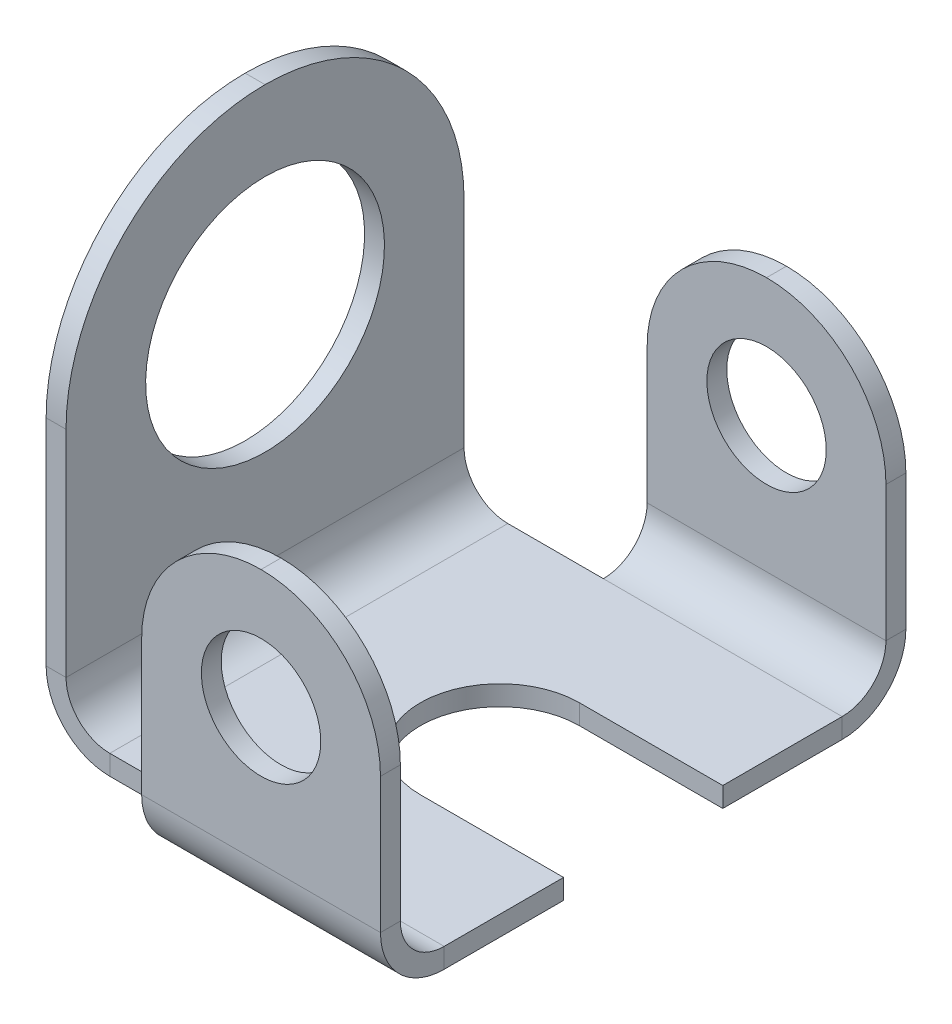
ISO-10303-21;
HEADER;
FILE_DESCRIPTION(('STEP AP214'),'2;1');
FILE_NAME('part.step','',(''),(''),'','','');
FILE_SCHEMA(('AUTOMOTIVE_DESIGN { 1 0 10303 214 1 1 1 1 }'));
ENDSEC;
DATA;
#1=APPLICATION_CONTEXT('core data for automotive mechanical design processes');
#2=APPLICATION_PROTOCOL_DEFINITION('international standard','automotive_design',2000,#1);
#3=PRODUCT_CONTEXT('',#1,'mechanical');
#4=PRODUCT('Part','Part','',(#3));
#5=PRODUCT_RELATED_PRODUCT_CATEGORY('part','',(#4));
#6=PRODUCT_DEFINITION_FORMATION('','',#4);
#7=PRODUCT_DEFINITION_CONTEXT('part definition',#1,'design');
#8=PRODUCT_DEFINITION('design','',#6,#7);
#9=PRODUCT_DEFINITION_SHAPE('','',#8);
#10=(LENGTH_UNIT() NAMED_UNIT(*) SI_UNIT(.MILLI.,.METRE.));
#11=(NAMED_UNIT(*) PLANE_ANGLE_UNIT() SI_UNIT($,.RADIAN.));
#12=(NAMED_UNIT(*) SI_UNIT($,.STERADIAN.) SOLID_ANGLE_UNIT());
#13=UNCERTAINTY_MEASURE_WITH_UNIT(LENGTH_MEASURE(1.E-05),#10,'distance_accuracy_value','');
#14=(GEOMETRIC_REPRESENTATION_CONTEXT(3) GLOBAL_UNCERTAINTY_ASSIGNED_CONTEXT((#13)) GLOBAL_UNIT_ASSIGNED_CONTEXT((#10,
#11,#12)) REPRESENTATION_CONTEXT('',''));
#15=CARTESIAN_POINT('',(0.,0.,0.));
#16=DIRECTION('',(0.,0.,1.));
#17=DIRECTION('',(1.,0.,0.));
#18=AXIS2_PLACEMENT_3D('',#15,#16,#17);
#19=CARTESIAN_POINT('',(25.,2.5,25.));
#20=DIRECTION('',(-1.,0.,0.));
#21=DIRECTION('',(0.,0.,1.));
#22=AXIS2_PLACEMENT_3D('',#19,#20,#21);
#23=PLANE('',#22);
#24=DIRECTION('',(0.,0.,-1.));
#25=VECTOR('',#24,1.);
#26=CARTESIAN_POINT('',(25.,2.5,25.));
#27=LINE('',#26,#25);
#28=CARTESIAN_POINT('',(25.,2.5,-10.));
#29=VERTEX_POINT('',#28);
#30=CARTESIAN_POINT('',(25.,2.49999999999994,-25.));
#31=VERTEX_POINT('',#30);
#32=EDGE_CURVE('E512',#29,#31,#27,.T.);
#33=ORIENTED_EDGE('',*,*,#32,.F.);
#34=DIRECTION('',(0.,-1.,0.));
#35=VECTOR('',#34,1.);
#36=CARTESIAN_POINT('',(25.,2.5,-10.));
#37=LINE('',#36,#35);
#38=CARTESIAN_POINT('',(25.,0.,-10.));
#39=VERTEX_POINT('',#38);
#40=EDGE_CURVE('E13',#29,#39,#37,.T.);
#41=ORIENTED_EDGE('',*,*,#40,.T.);
#42=DIRECTION('',(0.,0.,-1.));
#43=VECTOR('',#42,1.);
#44=CARTESIAN_POINT('',(25.,0.,25.));
#45=LINE('',#44,#43);
#46=CARTESIAN_POINT('',(25.,0.,-25.));
#47=VERTEX_POINT('',#46);
#48=EDGE_CURVE('E505',#39,#47,#45,.T.);
#49=ORIENTED_EDGE('',*,*,#48,.T.);
#50=DIRECTION('',(0.,-1.,0.));
#51=VECTOR('',#50,1.);
#52=CARTESIAN_POINT('',(25.,2.5,-25.));
#53=LINE('',#52,#51);
#54=EDGE_CURVE('E534',#31,#47,#53,.T.);
#55=ORIENTED_EDGE('',*,*,#54,.F.);
#56=EDGE_LOOP('',(#33,#41,#49,#55));
#57=FACE_BOUND('',#56,.T.);
#58=ADVANCED_FACE('F102',(#57),#23,.F.);
#59=CARTESIAN_POINT('',(-25.,2.5,25.));
#60=DIRECTION('',(0.,0.,-1.));
#61=DIRECTION('',(-1.,0.,0.));
#62=AXIS2_PLACEMENT_3D('',#59,#60,#61);
#63=PLANE('',#62);
#64=DIRECTION('',(0.,-1.,0.));
#65=VECTOR('',#64,1.);
#66=CARTESIAN_POINT('',(-5.,2.49999999999998,25.));
#67=LINE('',#66,#65);
#68=CARTESIAN_POINT('',(-5.,2.5,25.));
#69=VERTEX_POINT('',#68);
#70=CARTESIAN_POINT('',(-5.,0.,25.));
#71=VERTEX_POINT('',#70);
#72=EDGE_CURVE('E416',#69,#71,#67,.T.);
#73=ORIENTED_EDGE('',*,*,#72,.F.);
#74=DIRECTION('',(1.,0.,0.));
#75=VECTOR('',#74,1.);
#76=CARTESIAN_POINT('',(-25.,2.5,25.));
#77=LINE('',#76,#75);
#78=CARTESIAN_POINT('',(-17.,2.5,25.));
#79=VERTEX_POINT('',#78);
#80=EDGE_CURVE('E519',#79,#69,#77,.T.);
#81=ORIENTED_EDGE('',*,*,#80,.F.);
#82=DIRECTION('',(0.,-1.,0.));
#83=VECTOR('',#82,1.);
#84=CARTESIAN_POINT('',(-17.,2.5,25.));
#85=LINE('',#84,#83);
#86=CARTESIAN_POINT('',(-17.,0.,25.));
#87=VERTEX_POINT('',#86);
#88=EDGE_CURVE('E482',#79,#87,#85,.T.);
#89=ORIENTED_EDGE('',*,*,#88,.T.);
#90=DIRECTION('',(1.,0.,0.));
#91=VECTOR('',#90,1.);
#92=CARTESIAN_POINT('',(-25.,0.,25.));
#93=LINE('',#92,#91);
#94=EDGE_CURVE('E529',#87,#71,#93,.T.);
#95=ORIENTED_EDGE('',*,*,#94,.T.);
#96=EDGE_LOOP('',(#73,#81,#89,#95));
#97=FACE_BOUND('',#96,.T.);
#98=ADVANCED_FACE('F648',(#97),#63,.F.);
#99=CARTESIAN_POINT('',(-25.,2.5,-25.));
#100=DIRECTION('',(0.,0.,1.));
#101=DIRECTION('',(1.,0.,0.));
#102=AXIS2_PLACEMENT_3D('',#99,#100,#101);
#103=PLANE('',#102);
#104=DIRECTION('',(-1.,0.,0.));
#105=VECTOR('',#104,1.);
#106=CARTESIAN_POINT('',(-25.,2.5,-25.));
#107=LINE('',#106,#105);
#108=CARTESIAN_POINT('',(-5.,2.49999999999994,-25.));
#109=VERTEX_POINT('',#108);
#110=CARTESIAN_POINT('',(-17.,2.5,-25.));
#111=VERTEX_POINT('',#110);
#112=EDGE_CURVE('E509',#109,#111,#107,.T.);
#113=ORIENTED_EDGE('',*,*,#112,.F.);
#114=DIRECTION('',(0.,-1.,0.));
#115=VECTOR('',#114,1.);
#116=CARTESIAN_POINT('',(-5.,2.49999999999994,-25.));
#117=LINE('',#116,#115);
#118=CARTESIAN_POINT('',(-5.,0.,-25.));
#119=VERTEX_POINT('',#118);
#120=EDGE_CURVE('E365',#109,#119,#117,.T.);
#121=ORIENTED_EDGE('',*,*,#120,.T.);
#122=DIRECTION('',(-1.,0.,0.));
#123=VECTOR('',#122,1.);
#124=CARTESIAN_POINT('',(-25.,0.,-25.));
#125=LINE('',#124,#123);
#126=CARTESIAN_POINT('',(-17.,0.,-25.));
#127=VERTEX_POINT('',#126);
#128=EDGE_CURVE('E522',#119,#127,#125,.T.);
#129=ORIENTED_EDGE('',*,*,#128,.T.);
#130=DIRECTION('',(0.,-1.,0.));
#131=VECTOR('',#130,1.);
#132=CARTESIAN_POINT('',(-17.,2.5,-25.));
#133=LINE('',#132,#131);
#134=EDGE_CURVE('E498',#111,#127,#133,.T.);
#135=ORIENTED_EDGE('',*,*,#134,.F.);
#136=EDGE_LOOP('',(#113,#121,#129,#135));
#137=FACE_BOUND('',#136,.T.);
#138=ADVANCED_FACE('F750',(#137),#103,.F.);
#139=CARTESIAN_POINT('',(0.,2.5,0.));
#140=DIRECTION('',(0.,-1.,0.));
#141=DIRECTION('',(0.,0.,-1.));
#142=AXIS2_PLACEMENT_3D('',#139,#140,#141);
#143=PLANE('',#142);
#144=CARTESIAN_POINT('',(7.,2.5,0.));
#145=DIRECTION('',(0.,-1.,0.));
#146=DIRECTION('',(0.,0.,-1.));
#147=AXIS2_PLACEMENT_3D('',#144,#145,#146);
#148=CIRCLE('',#147,10.);
#149=CARTESIAN_POINT('',(7.,2.5,10.));
#150=VERTEX_POINT('',#149);
#151=CARTESIAN_POINT('',(7.,2.5,-10.));
#152=VERTEX_POINT('',#151);
#153=EDGE_CURVE('E285',#150,#152,#148,.T.);
#154=ORIENTED_EDGE('',*,*,#153,.T.);
#155=DIRECTION('',(1.,0.,0.));
#156=VECTOR('',#155,1.);
#157=CARTESIAN_POINT('',(0.,2.5,-10.));
#158=LINE('',#157,#156);
#159=EDGE_CURVE('E310',#152,#29,#158,.T.);
#160=ORIENTED_EDGE('',*,*,#159,.T.);
#161=ORIENTED_EDGE('',*,*,#32,.T.);
#162=EDGE_CURVE('E515',#31,#109,#107,.T.);
#163=ORIENTED_EDGE('',*,*,#162,.T.);
#164=ORIENTED_EDGE('',*,*,#112,.T.);
#165=DIRECTION('',(0.,0.,1.));
#166=VECTOR('',#165,1.);
#167=CARTESIAN_POINT('',(-17.,2.5,25.));
#168=LINE('',#167,#166);
#169=EDGE_CURVE('E493',#79,#111,#168,.F.);
#170=ORIENTED_EDGE('',*,*,#169,.F.);
#171=ORIENTED_EDGE('',*,*,#80,.T.);
#172=DIRECTION('',(1.,0.,0.));
#173=VECTOR('',#172,1.);
#174=CARTESIAN_POINT('',(25.,2.49999999999998,25.));
#175=LINE('',#174,#173);
#176=CARTESIAN_POINT('',(25.,2.5,25.));
#177=VERTEX_POINT('',#176);
#178=EDGE_CURVE('E425',#177,#69,#175,.F.);
#179=ORIENTED_EDGE('',*,*,#178,.F.);
#180=CARTESIAN_POINT('',(25.,2.5,10.));
#181=VERTEX_POINT('',#180);
#182=EDGE_CURVE('E506',#177,#181,#27,.T.);
#183=ORIENTED_EDGE('',*,*,#182,.T.);
#184=DIRECTION('',(-1.,0.,0.));
#185=VECTOR('',#184,1.);
#186=CARTESIAN_POINT('',(0.,2.5,10.));
#187=LINE('',#186,#185);
#188=EDGE_CURVE('E122',#181,#150,#187,.T.);
#189=ORIENTED_EDGE('',*,*,#188,.T.);
#190=EDGE_LOOP('',(#154,#160,#161,#163,#164,#170,#171,#179,#183,#189));
#191=FACE_BOUND('',#190,.T.);
#192=ADVANCED_FACE('F615',(#191),#143,.F.);
#193=CARTESIAN_POINT('',(0.,0.,0.));
#194=DIRECTION('',(0.,-1.,0.));
#195=DIRECTION('',(0.,0.,-1.));
#196=AXIS2_PLACEMENT_3D('',#193,#194,#195);
#197=PLANE('',#196);
#198=DIRECTION('',(-1.,0.,0.));
#199=VECTOR('',#198,1.);
#200=CARTESIAN_POINT('',(7.,0.,-10.));
#201=LINE('',#200,#199);
#202=CARTESIAN_POINT('',(7.,0.,-10.));
#203=VERTEX_POINT('',#202);
#204=EDGE_CURVE('E284',#39,#203,#201,.T.);
#205=ORIENTED_EDGE('',*,*,#204,.T.);
#206=CARTESIAN_POINT('',(7.,0.,0.));
#207=DIRECTION('',(0.,1.,0.));
#208=DIRECTION('',(0.,0.,1.));
#209=AXIS2_PLACEMENT_3D('',#206,#207,#208);
#210=CIRCLE('',#209,10.);
#211=CARTESIAN_POINT('',(7.,0.,10.));
#212=VERTEX_POINT('',#211);
#213=EDGE_CURVE('E276',#203,#212,#210,.T.);
#214=ORIENTED_EDGE('',*,*,#213,.T.);
#215=DIRECTION('',(1.,0.,0.));
#216=VECTOR('',#215,1.);
#217=CARTESIAN_POINT('',(7.,0.,10.));
#218=LINE('',#217,#216);
#219=CARTESIAN_POINT('',(25.,0.,10.));
#220=VERTEX_POINT('',#219);
#221=EDGE_CURVE('E287',#212,#220,#218,.T.);
#222=ORIENTED_EDGE('',*,*,#221,.T.);
#223=CARTESIAN_POINT('',(25.,0.,25.));
#224=VERTEX_POINT('',#223);
#225=EDGE_CURVE('E521',#224,#220,#45,.T.);
#226=ORIENTED_EDGE('',*,*,#225,.F.);
#227=DIRECTION('',(1.,0.,0.));
#228=VECTOR('',#227,1.);
#229=CARTESIAN_POINT('',(25.,0.,25.));
#230=LINE('',#229,#228);
#231=EDGE_CURVE('E410',#224,#71,#230,.F.);
#232=ORIENTED_EDGE('',*,*,#231,.T.);
#233=ORIENTED_EDGE('',*,*,#94,.F.);
#234=DIRECTION('',(0.,0.,1.));
#235=VECTOR('',#234,1.);
#236=CARTESIAN_POINT('',(-17.,0.,25.));
#237=LINE('',#236,#235);
#238=EDGE_CURVE('E471',#87,#127,#237,.F.);
#239=ORIENTED_EDGE('',*,*,#238,.T.);
#240=ORIENTED_EDGE('',*,*,#128,.F.);
#241=EDGE_CURVE('E524',#47,#119,#125,.T.);
#242=ORIENTED_EDGE('',*,*,#241,.F.);
#243=ORIENTED_EDGE('',*,*,#48,.F.);
#244=EDGE_LOOP('',(#205,#214,#222,#226,#232,#233,#239,#240,#242,#243));
#245=FACE_BOUND('',#244,.T.);
#246=ADVANCED_FACE('F294',(#245),#197,.T.);
#247=ORIENTED_EDGE('',*,*,#225,.T.);
#248=DIRECTION('',(0.,1.,0.));
#249=VECTOR('',#248,1.);
#250=CARTESIAN_POINT('',(25.,2.5,10.));
#251=LINE('',#250,#249);
#252=EDGE_CURVE('E112',#220,#181,#251,.T.);
#253=ORIENTED_EDGE('',*,*,#252,.T.);
#254=ORIENTED_EDGE('',*,*,#182,.F.);
#255=DIRECTION('',(0.,-1.,0.));
#256=VECTOR('',#255,1.);
#257=CARTESIAN_POINT('',(25.,2.5,25.));
#258=LINE('',#257,#256);
#259=EDGE_CURVE('E517',#177,#224,#258,.T.);
#260=ORIENTED_EDGE('',*,*,#259,.T.);
#261=EDGE_LOOP('',(#247,#253,#254,#260));
#262=FACE_BOUND('',#261,.T.);
#263=ADVANCED_FACE('F607',(#262),#23,.F.);
#264=CARTESIAN_POINT('',(-17.,8.,-25.));
#265=DIRECTION('',(0.,0.,-1.));
#266=DIRECTION('',(-1.,0.,0.));
#267=AXIS2_PLACEMENT_3D('',#264,#265,#266);
#268=PLANE('',#267);
#269=DIRECTION('',(-1.,0.,0.));
#270=VECTOR('',#269,1.);
#271=CARTESIAN_POINT('',(-25.,7.99999999999997,-25.));
#272=LINE('',#271,#270);
#273=CARTESIAN_POINT('',(-22.5,7.99999999999998,-25.));
#274=VERTEX_POINT('',#273);
#275=CARTESIAN_POINT('',(-25.,7.99999999999997,-25.));
#276=VERTEX_POINT('',#275);
#277=EDGE_CURVE('E468',#274,#276,#272,.T.);
#278=ORIENTED_EDGE('',*,*,#277,.F.);
#279=CARTESIAN_POINT('',(-17.,8.,-25.));
#280=DIRECTION('',(0.,0.,1.));
#281=DIRECTION('',(1.,0.,0.));
#282=AXIS2_PLACEMENT_3D('',#279,#280,#281);
#283=CIRCLE('',#282,5.5);
#284=EDGE_CURVE('E487',#111,#274,#283,.F.);
#285=ORIENTED_EDGE('',*,*,#284,.F.);
#286=ORIENTED_EDGE('',*,*,#134,.T.);
#287=CARTESIAN_POINT('',(-17.,8.,-25.));
#288=DIRECTION('',(0.,0.,1.));
#289=DIRECTION('',(1.,0.,0.));
#290=AXIS2_PLACEMENT_3D('',#287,#288,#289);
#291=CIRCLE('',#290,8.);
#292=EDGE_CURVE('E476',#127,#276,#291,.F.);
#293=ORIENTED_EDGE('',*,*,#292,.T.);
#294=EDGE_LOOP('',(#278,#285,#286,#293));
#295=FACE_BOUND('',#294,.T.);
#296=ADVANCED_FACE('F751',(#295),#268,.T.);
#297=CARTESIAN_POINT('',(-17.,8.,25.));
#298=DIRECTION('',(0.,0.,-1.));
#299=DIRECTION('',(-1.,0.,0.));
#300=AXIS2_PLACEMENT_3D('',#297,#298,#299);
#301=PLANE('',#300);
#302=CARTESIAN_POINT('',(-17.,8.,25.));
#303=DIRECTION('',(0.,0.,1.));
#304=DIRECTION('',(1.,0.,0.));
#305=AXIS2_PLACEMENT_3D('',#302,#303,#304);
#306=CIRCLE('',#305,5.5);
#307=CARTESIAN_POINT('',(-22.5,7.99999999999998,25.));
#308=VERTEX_POINT('',#307);
#309=EDGE_CURVE('E447',#308,#79,#306,.T.);
#310=ORIENTED_EDGE('',*,*,#309,.F.);
#311=DIRECTION('',(-1.,0.,0.));
#312=VECTOR('',#311,1.);
#313=CARTESIAN_POINT('',(-22.5,7.99999999999998,25.));
#314=LINE('',#313,#312);
#315=CARTESIAN_POINT('',(-25.,7.99999999999997,25.));
#316=VERTEX_POINT('',#315);
#317=EDGE_CURVE('E465',#308,#316,#314,.T.);
#318=ORIENTED_EDGE('',*,*,#317,.T.);
#319=CARTESIAN_POINT('',(-17.,8.,25.));
#320=DIRECTION('',(0.,0.,1.));
#321=DIRECTION('',(1.,0.,0.));
#322=AXIS2_PLACEMENT_3D('',#319,#320,#321);
#323=CIRCLE('',#322,8.);
#324=EDGE_CURVE('E477',#316,#87,#323,.T.);
#325=ORIENTED_EDGE('',*,*,#324,.T.);
#326=ORIENTED_EDGE('',*,*,#88,.F.);
#327=EDGE_LOOP('',(#310,#318,#325,#326));
#328=FACE_BOUND('',#327,.T.);
#329=ADVANCED_FACE('F655',(#328),#301,.F.);
#330=CARTESIAN_POINT('',(-17.,8.,25.));
#331=DIRECTION('',(0.,0.,1.));
#332=DIRECTION('',(-1.,0.,0.));
#333=AXIS2_PLACEMENT_3D('',#330,#331,#332);
#334=CYLINDRICAL_SURFACE('',#333,8.);
#335=ORIENTED_EDGE('',*,*,#238,.F.);
#336=ORIENTED_EDGE('',*,*,#324,.F.);
#337=DIRECTION('',(0.,0.,1.));
#338=VECTOR('',#337,1.);
#339=CARTESIAN_POINT('',(-25.,7.99999999999997,0.));
#340=LINE('',#339,#338);
#341=EDGE_CURVE('E458',#276,#316,#340,.T.);
#342=ORIENTED_EDGE('',*,*,#341,.F.);
#343=ORIENTED_EDGE('',*,*,#292,.F.);
#344=EDGE_LOOP('',(#335,#336,#342,#343));
#345=FACE_BOUND('',#344,.T.);
#346=ADVANCED_FACE('F753',(#345),#334,.T.);
#347=CARTESIAN_POINT('',(-17.,8.,25.));
#348=DIRECTION('',(0.,0.,1.));
#349=DIRECTION('',(-1.,0.,0.));
#350=AXIS2_PLACEMENT_3D('',#347,#348,#349);
#351=CYLINDRICAL_SURFACE('',#350,5.5);
#352=ORIENTED_EDGE('',*,*,#169,.T.);
#353=ORIENTED_EDGE('',*,*,#284,.T.);
#354=DIRECTION('',(0.,0.,-1.));
#355=VECTOR('',#354,1.);
#356=CARTESIAN_POINT('',(-22.5,7.99999999999998,-25.));
#357=LINE('',#356,#355);
#358=EDGE_CURVE('E467',#274,#308,#357,.F.);
#359=ORIENTED_EDGE('',*,*,#358,.T.);
#360=ORIENTED_EDGE('',*,*,#309,.T.);
#361=EDGE_LOOP('',(#352,#353,#359,#360));
#362=FACE_BOUND('',#361,.T.);
#363=ADVANCED_FACE('F658',(#362),#351,.F.);
#364=CARTESIAN_POINT('',(-25.,2.49999999999999,25.));
#365=DIRECTION('',(0.,0.,1.));
#366=DIRECTION('',(1.,0.,0.));
#367=AXIS2_PLACEMENT_3D('',#364,#365,#366);
#368=PLANE('',#367);
#369=DIRECTION('',(0.,1.,0.));
#370=VECTOR('',#369,1.);
#371=CARTESIAN_POINT('',(-22.5,0.,25.));
#372=LINE('',#371,#370);
#373=CARTESIAN_POINT('',(-22.5000000000001,35.,25.));
#374=VERTEX_POINT('',#373);
#375=EDGE_CURVE('E454',#374,#308,#372,.F.);
#376=ORIENTED_EDGE('',*,*,#375,.F.);
#377=DIRECTION('',(1.,0.,0.));
#378=VECTOR('',#377,1.);
#379=CARTESIAN_POINT('',(-25.0000000000001,35.,25.));
#380=LINE('',#379,#378);
#381=CARTESIAN_POINT('',(-25.0000000000001,35.,25.));
#382=VERTEX_POINT('',#381);
#383=EDGE_CURVE('E555',#374,#382,#380,.F.);
#384=ORIENTED_EDGE('',*,*,#383,.T.);
#385=DIRECTION('',(0.,-1.,0.));
#386=VECTOR('',#385,1.);
#387=CARTESIAN_POINT('',(-25.,2.49999999999999,25.));
#388=LINE('',#387,#386);
#389=EDGE_CURVE('E442',#382,#316,#388,.T.);
#390=ORIENTED_EDGE('',*,*,#389,.T.);
#391=ORIENTED_EDGE('',*,*,#317,.F.);
#392=EDGE_LOOP('',(#376,#384,#390,#391));
#393=FACE_BOUND('',#392,.T.);
#394=ADVANCED_FACE('F774',(#393),#368,.T.);
#395=CARTESIAN_POINT('',(-25.0000000000002,60.,-25.));
#396=DIRECTION('',(0.,0.,-1.));
#397=DIRECTION('',(-1.,0.,0.));
#398=AXIS2_PLACEMENT_3D('',#395,#396,#397);
#399=PLANE('',#398);
#400=DIRECTION('',(0.,1.,0.));
#401=VECTOR('',#400,1.);
#402=CARTESIAN_POINT('',(-25.0000000000002,60.,-25.));
#403=LINE('',#402,#401);
#404=CARTESIAN_POINT('',(-25.0000000000001,35.,-25.));
#405=VERTEX_POINT('',#404);
#406=EDGE_CURVE('E450',#276,#405,#403,.T.);
#407=ORIENTED_EDGE('',*,*,#406,.T.);
#408=DIRECTION('',(1.,0.,0.));
#409=VECTOR('',#408,1.);
#410=CARTESIAN_POINT('',(-25.0000000000001,35.,-25.));
#411=LINE('',#410,#409);
#412=CARTESIAN_POINT('',(-22.5000000000001,35.,-25.));
#413=VERTEX_POINT('',#412);
#414=EDGE_CURVE('E539',#405,#413,#411,.T.);
#415=ORIENTED_EDGE('',*,*,#414,.T.);
#416=DIRECTION('',(0.,-1.,0.));
#417=VECTOR('',#416,1.);
#418=CARTESIAN_POINT('',(-22.5,0.,-25.));
#419=LINE('',#418,#417);
#420=EDGE_CURVE('E453',#274,#413,#419,.F.);
#421=ORIENTED_EDGE('',*,*,#420,.F.);
#422=ORIENTED_EDGE('',*,*,#277,.T.);
#423=EDGE_LOOP('',(#407,#415,#421,#422));
#424=FACE_BOUND('',#423,.T.);
#425=ADVANCED_FACE('F757',(#424),#399,.T.);
#426=CARTESIAN_POINT('',(-25.,0.,0.));
#427=DIRECTION('',(-1.,0.,0.));
#428=DIRECTION('',(0.,-1.,0.));
#429=AXIS2_PLACEMENT_3D('',#426,#427,#428);
#430=PLANE('',#429);
#431=CARTESIAN_POINT('',(-25.0000000000001,35.,0.));
#432=DIRECTION('',(-1.,0.,0.));
#433=DIRECTION('',(0.,-1.,0.));
#434=AXIS2_PLACEMENT_3D('',#431,#432,#433);
#435=CIRCLE('',#434,15.);
#436=CARTESIAN_POINT('',(-25.0000000000001,20.,0.));
#437=VERTEX_POINT('',#436);
#438=EDGE_CURVE('E438',#437,#437,#435,.T.);
#439=ORIENTED_EDGE('',*,*,#438,.F.);
#440=EDGE_LOOP('',(#439));
#441=FACE_BOUND('',#440,.T.);
#442=CARTESIAN_POINT('',(-25.0000000000001,35.,0.));
#443=DIRECTION('',(-1.,0.,0.));
#444=DIRECTION('',(0.,-1.,0.));
#445=AXIS2_PLACEMENT_3D('',#442,#443,#444);
#446=CIRCLE('',#445,25.);
#447=CARTESIAN_POINT('',(-25.0000000000002,60.,0.));
#448=VERTEX_POINT('',#447);
#449=EDGE_CURVE('E547',#382,#448,#446,.T.);
#450=ORIENTED_EDGE('',*,*,#449,.T.);
#451=CARTESIAN_POINT('',(-25.0000000000001,35.,0.));
#452=DIRECTION('',(-1.,0.,0.));
#453=DIRECTION('',(0.,-1.,0.));
#454=AXIS2_PLACEMENT_3D('',#451,#452,#453);
#455=CIRCLE('',#454,25.);
#456=EDGE_CURVE('E553',#448,#405,#455,.T.);
#457=ORIENTED_EDGE('',*,*,#456,.T.);
#458=ORIENTED_EDGE('',*,*,#406,.F.);
#459=ORIENTED_EDGE('',*,*,#341,.T.);
#460=ORIENTED_EDGE('',*,*,#389,.F.);
#461=EDGE_LOOP('',(#450,#457,#458,#459,#460));
#462=FACE_BOUND('',#461,.T.);
#463=ADVANCED_FACE('F773',(#441,#462),#430,.T.);
#464=CARTESIAN_POINT('',(-22.5,0.,0.));
#465=DIRECTION('',(-1.,0.,0.));
#466=DIRECTION('',(0.,-1.,0.));
#467=AXIS2_PLACEMENT_3D('',#464,#465,#466);
#468=PLANE('',#467);
#469=CARTESIAN_POINT('',(-22.5000000000001,35.,0.));
#470=DIRECTION('',(1.,0.,0.));
#471=DIRECTION('',(0.,1.,0.));
#472=AXIS2_PLACEMENT_3D('',#469,#470,#471);
#473=CIRCLE('',#472,15.);
#474=CARTESIAN_POINT('',(-22.5000000000002,50.,0.));
#475=VERTEX_POINT('',#474);
#476=EDGE_CURVE('E432',#475,#475,#473,.T.);
#477=ORIENTED_EDGE('',*,*,#476,.F.);
#478=EDGE_LOOP('',(#477));
#479=FACE_BOUND('',#478,.T.);
#480=ORIENTED_EDGE('',*,*,#420,.T.);
#481=CARTESIAN_POINT('',(-22.5000000000001,35.,0.));
#482=DIRECTION('',(-1.,0.,0.));
#483=DIRECTION('',(0.,-1.,0.));
#484=AXIS2_PLACEMENT_3D('',#481,#482,#483);
#485=CIRCLE('',#484,25.);
#486=CARTESIAN_POINT('',(-22.5000000000002,60.,0.));
#487=VERTEX_POINT('',#486);
#488=EDGE_CURVE('E544',#413,#487,#485,.F.);
#489=ORIENTED_EDGE('',*,*,#488,.T.);
#490=CARTESIAN_POINT('',(-22.5000000000001,35.,0.));
#491=DIRECTION('',(-1.,0.,0.));
#492=DIRECTION('',(0.,-1.,0.));
#493=AXIS2_PLACEMENT_3D('',#490,#491,#492);
#494=CIRCLE('',#493,25.);
#495=EDGE_CURVE('E545',#487,#374,#494,.F.);
#496=ORIENTED_EDGE('',*,*,#495,.T.);
#497=ORIENTED_EDGE('',*,*,#375,.T.);
#498=ORIENTED_EDGE('',*,*,#358,.F.);
#499=EDGE_LOOP('',(#480,#489,#496,#497,#498));
#500=FACE_BOUND('',#499,.T.);
#501=ADVANCED_FACE('F756',(#479,#500),#468,.F.);
#502=CARTESIAN_POINT('',(-25.0000000000001,35.,0.));
#503=DIRECTION('',(1.,0.,0.));
#504=DIRECTION('',(0.,1.,0.));
#505=AXIS2_PLACEMENT_3D('',#502,#503,#504);
#506=CYLINDRICAL_SURFACE('',#505,25.);
#507=DIRECTION('',(1.,0.,0.));
#508=VECTOR('',#507,1.);
#509=CARTESIAN_POINT('',(-25.0000000000002,60.,0.));
#510=LINE('',#509,#508);
#511=EDGE_CURVE('E445',#448,#487,#510,.T.);
#512=ORIENTED_EDGE('',*,*,#511,.F.);
#513=ORIENTED_EDGE('',*,*,#449,.F.);
#514=ORIENTED_EDGE('',*,*,#383,.F.);
#515=ORIENTED_EDGE('',*,*,#495,.F.);
#516=EDGE_LOOP('',(#512,#513,#514,#515));
#517=FACE_BOUND('',#516,.T.);
#518=ADVANCED_FACE('F768',(#517),#506,.T.);
#519=CARTESIAN_POINT('',(-25.0000000000001,35.,0.));
#520=DIRECTION('',(1.,0.,0.));
#521=DIRECTION('',(0.,1.,0.));
#522=AXIS2_PLACEMENT_3D('',#519,#520,#521);
#523=CYLINDRICAL_SURFACE('',#522,25.);
#524=ORIENTED_EDGE('',*,*,#456,.F.);
#525=ORIENTED_EDGE('',*,*,#511,.T.);
#526=ORIENTED_EDGE('',*,*,#488,.F.);
#527=ORIENTED_EDGE('',*,*,#414,.F.);
#528=EDGE_LOOP('',(#524,#525,#526,#527));
#529=FACE_BOUND('',#528,.T.);
#530=ADVANCED_FACE('F762',(#529),#523,.T.);
#531=CARTESIAN_POINT('',(-32.5000000000001,35.,0.));
#532=DIRECTION('',(1.,0.,0.));
#533=DIRECTION('',(0.,1.,0.));
#534=AXIS2_PLACEMENT_3D('',#531,#532,#533);
#535=CYLINDRICAL_SURFACE('',#534,15.);
#536=ORIENTED_EDGE('',*,*,#438,.T.);
#537=EDGE_LOOP('',(#536));
#538=FACE_BOUND('',#537,.T.);
#539=ORIENTED_EDGE('',*,*,#476,.T.);
#540=EDGE_LOOP('',(#539));
#541=FACE_BOUND('',#540,.T.);
#542=ADVANCED_FACE('F1081',(#538,#541),#535,.F.);
#543=CARTESIAN_POINT('',(-5.,7.99999999999998,25.));
#544=DIRECTION('',(-1.,0.,0.));
#545=DIRECTION('',(0.,0.,1.));
#546=AXIS2_PLACEMENT_3D('',#543,#544,#545);
#547=PLANE('',#546);
#548=DIRECTION('',(0.,0.,1.));
#549=VECTOR('',#548,1.);
#550=CARTESIAN_POINT('',(-5.,7.99999999999998,33.0000000000001));
#551=LINE('',#550,#549);
#552=CARTESIAN_POINT('',(-5.,7.99999999999996,30.5));
#553=VERTEX_POINT('',#552);
#554=CARTESIAN_POINT('',(-5.,7.99999999999995,33.));
#555=VERTEX_POINT('',#554);
#556=EDGE_CURVE('E376',#553,#555,#551,.T.);
#557=ORIENTED_EDGE('',*,*,#556,.F.);
#558=CARTESIAN_POINT('',(-5.,7.99999999999998,25.));
#559=DIRECTION('',(1.,0.,0.));
#560=DIRECTION('',(0.,0.,-1.));
#561=AXIS2_PLACEMENT_3D('',#558,#559,#560);
#562=CIRCLE('',#561,5.5);
#563=EDGE_CURVE('E419',#69,#553,#562,.F.);
#564=ORIENTED_EDGE('',*,*,#563,.F.);
#565=ORIENTED_EDGE('',*,*,#72,.T.);
#566=CARTESIAN_POINT('',(-5.,7.99999999999998,25.));
#567=DIRECTION('',(1.,0.,0.));
#568=DIRECTION('',(0.,0.,-1.));
#569=AXIS2_PLACEMENT_3D('',#566,#567,#568);
#570=CIRCLE('',#569,8.);
#571=EDGE_CURVE('E413',#71,#555,#570,.F.);
#572=ORIENTED_EDGE('',*,*,#571,.T.);
#573=EDGE_LOOP('',(#557,#564,#565,#572));
#574=FACE_BOUND('',#573,.T.);
#575=ADVANCED_FACE('F623',(#574),#547,.T.);
#576=CARTESIAN_POINT('',(25.,7.99999999999998,25.));
#577=DIRECTION('',(-1.,0.,0.));
#578=DIRECTION('',(0.,0.,1.));
#579=AXIS2_PLACEMENT_3D('',#576,#577,#578);
#580=PLANE('',#579);
#581=CARTESIAN_POINT('',(25.,7.99999999999998,25.));
#582=DIRECTION('',(1.,0.,0.));
#583=DIRECTION('',(0.,0.,-1.));
#584=AXIS2_PLACEMENT_3D('',#581,#582,#583);
#585=CIRCLE('',#584,5.5);
#586=CARTESIAN_POINT('',(25.,7.99999999999996,30.5));
#587=VERTEX_POINT('',#586);
#588=EDGE_CURVE('E379',#587,#177,#585,.T.);
#589=ORIENTED_EDGE('',*,*,#588,.F.);
#590=DIRECTION('',(0.,0.,1.));
#591=VECTOR('',#590,1.);
#592=CARTESIAN_POINT('',(25.,7.99999999999998,30.5));
#593=LINE('',#592,#591);
#594=CARTESIAN_POINT('',(25.,7.99999999999998,33.));
#595=VERTEX_POINT('',#594);
#596=EDGE_CURVE('E398',#587,#595,#593,.T.);
#597=ORIENTED_EDGE('',*,*,#596,.T.);
#598=CARTESIAN_POINT('',(25.,7.99999999999998,25.));
#599=DIRECTION('',(1.,0.,0.));
#600=DIRECTION('',(0.,0.,-1.));
#601=AXIS2_PLACEMENT_3D('',#598,#599,#600);
#602=CIRCLE('',#601,8.);
#603=EDGE_CURVE('E415',#595,#224,#602,.T.);
#604=ORIENTED_EDGE('',*,*,#603,.T.);
#605=ORIENTED_EDGE('',*,*,#259,.F.);
#606=EDGE_LOOP('',(#589,#597,#604,#605));
#607=FACE_BOUND('',#606,.T.);
#608=ADVANCED_FACE('F637',(#607),#580,.F.);
#609=CARTESIAN_POINT('',(25.,7.99999999999998,25.));
#610=DIRECTION('',(1.,0.,0.));
#611=DIRECTION('',(0.,0.,1.));
#612=AXIS2_PLACEMENT_3D('',#609,#610,#611);
#613=CYLINDRICAL_SURFACE('',#612,8.);
#614=ORIENTED_EDGE('',*,*,#231,.F.);
#615=ORIENTED_EDGE('',*,*,#603,.F.);
#616=DIRECTION('',(1.,0.,0.));
#617=VECTOR('',#616,1.);
#618=CARTESIAN_POINT('',(0.,7.99999999999998,33.));
#619=LINE('',#618,#617);
#620=EDGE_CURVE('E395',#555,#595,#619,.T.);
#621=ORIENTED_EDGE('',*,*,#620,.F.);
#622=ORIENTED_EDGE('',*,*,#571,.F.);
#623=EDGE_LOOP('',(#614,#615,#621,#622));
#624=FACE_BOUND('',#623,.T.);
#625=ADVANCED_FACE('F643',(#624),#613,.T.);
#626=CARTESIAN_POINT('',(25.,7.99999999999998,25.));
#627=DIRECTION('',(1.,0.,0.));
#628=DIRECTION('',(0.,0.,1.));
#629=AXIS2_PLACEMENT_3D('',#626,#627,#628);
#630=CYLINDRICAL_SURFACE('',#629,5.5);
#631=ORIENTED_EDGE('',*,*,#178,.T.);
#632=ORIENTED_EDGE('',*,*,#563,.T.);
#633=DIRECTION('',(-1.,0.,0.));
#634=VECTOR('',#633,1.);
#635=CARTESIAN_POINT('',(-5.,7.99999999999998,30.5));
#636=LINE('',#635,#634);
#637=EDGE_CURVE('E397',#553,#587,#636,.F.);
#638=ORIENTED_EDGE('',*,*,#637,.T.);
#639=ORIENTED_EDGE('',*,*,#588,.T.);
#640=EDGE_LOOP('',(#631,#632,#638,#639));
#641=FACE_BOUND('',#640,.T.);
#642=ADVANCED_FACE('F617',(#641),#630,.F.);
#643=CARTESIAN_POINT('',(25.,2.49999999999999,33.));
#644=DIRECTION('',(1.,0.,0.));
#645=DIRECTION('',(0.,0.,-1.));
#646=AXIS2_PLACEMENT_3D('',#643,#644,#645);
#647=PLANE('',#646);
#648=DIRECTION('',(0.,1.,0.));
#649=VECTOR('',#648,1.);
#650=CARTESIAN_POINT('',(25.,0.,30.5));
#651=LINE('',#650,#649);
#652=CARTESIAN_POINT('',(25.,24.9999999999998,30.5000000000001));
#653=VERTEX_POINT('',#652);
#654=EDGE_CURVE('E383',#653,#587,#651,.F.);
#655=ORIENTED_EDGE('',*,*,#654,.F.);
#656=DIRECTION('',(0.,0.,-1.));
#657=VECTOR('',#656,1.);
#658=CARTESIAN_POINT('',(25.,24.9999999999998,33.0000000000001));
#659=LINE('',#658,#657);
#660=CARTESIAN_POINT('',(25.,24.9999999999998,33.));
#661=VERTEX_POINT('',#660);
#662=EDGE_CURVE('E594',#653,#661,#659,.F.);
#663=ORIENTED_EDGE('',*,*,#662,.T.);
#664=DIRECTION('',(0.,-1.,0.));
#665=VECTOR('',#664,1.);
#666=CARTESIAN_POINT('',(25.,2.49999999999999,33.));
#667=LINE('',#666,#665);
#668=EDGE_CURVE('E380',#661,#595,#667,.T.);
#669=ORIENTED_EDGE('',*,*,#668,.T.);
#670=ORIENTED_EDGE('',*,*,#596,.F.);
#671=EDGE_LOOP('',(#655,#663,#669,#670));
#672=FACE_BOUND('',#671,.T.);
#673=ADVANCED_FACE('F639',(#672),#647,.T.);
#674=CARTESIAN_POINT('',(-5.,39.9999999999998,33.0000000000001));
#675=DIRECTION('',(-1.,0.,0.));
#676=DIRECTION('',(0.,-1.,0.));
#677=AXIS2_PLACEMENT_3D('',#674,#675,#676);
#678=PLANE('',#677);
#679=DIRECTION('',(0.,1.,0.));
#680=VECTOR('',#679,1.);
#681=CARTESIAN_POINT('',(-5.,39.9999999999998,33.0000000000001));
#682=LINE('',#681,#680);
#683=CARTESIAN_POINT('',(-5.,24.9999999999998,33.));
#684=VERTEX_POINT('',#683);
#685=EDGE_CURVE('E382',#555,#684,#682,.T.);
#686=ORIENTED_EDGE('',*,*,#685,.T.);
#687=DIRECTION('',(0.,0.,-1.));
#688=VECTOR('',#687,1.);
#689=CARTESIAN_POINT('',(-5.,24.9999999999998,33.0000000000001));
#690=LINE('',#689,#688);
#691=CARTESIAN_POINT('',(-5.,24.9999999999998,30.5000000000001));
#692=VERTEX_POINT('',#691);
#693=EDGE_CURVE('E576',#684,#692,#690,.T.);
#694=ORIENTED_EDGE('',*,*,#693,.T.);
#695=DIRECTION('',(0.,-1.,0.));
#696=VECTOR('',#695,1.);
#697=CARTESIAN_POINT('',(-5.,0.,30.5));
#698=LINE('',#697,#696);
#699=EDGE_CURVE('E390',#553,#692,#698,.F.);
#700=ORIENTED_EDGE('',*,*,#699,.F.);
#701=ORIENTED_EDGE('',*,*,#556,.T.);
#702=EDGE_LOOP('',(#686,#694,#700,#701));
#703=FACE_BOUND('',#702,.T.);
#704=ADVANCED_FACE('F626',(#703),#678,.T.);
#705=CARTESIAN_POINT('',(0.,0.,33.));
#706=DIRECTION('',(0.,0.,1.));
#707=DIRECTION('',(0.,-1.,0.));
#708=AXIS2_PLACEMENT_3D('',#705,#706,#707);
#709=PLANE('',#708);
#710=CARTESIAN_POINT('',(10.,25.0000000000001,33.0000000000002));
#711=DIRECTION('',(0.,0.,-1.));
#712=DIRECTION('',(0.,1.,0.));
#713=AXIS2_PLACEMENT_3D('',#710,#711,#712);
#714=CIRCLE('',#713,7.5);
#715=CARTESIAN_POINT('',(10.,32.5000000000001,33.0000000000002));
#716=VERTEX_POINT('',#715);
#717=EDGE_CURVE('E312',#716,#716,#714,.T.);
#718=ORIENTED_EDGE('',*,*,#717,.T.);
#719=EDGE_LOOP('',(#718));
#720=FACE_BOUND('',#719,.T.);
#721=CARTESIAN_POINT('',(10.,24.9999999999998,33.0000000000001));
#722=DIRECTION('',(0.,0.,1.));
#723=DIRECTION('',(0.,-1.,0.));
#724=AXIS2_PLACEMENT_3D('',#721,#722,#723);
#725=CIRCLE('',#724,15.);
#726=CARTESIAN_POINT('',(10.,39.9999999999998,33.0000000000001));
#727=VERTEX_POINT('',#726);
#728=EDGE_CURVE('E128',#661,#727,#725,.T.);
#729=ORIENTED_EDGE('',*,*,#728,.T.);
#730=CARTESIAN_POINT('',(10.,24.9999999999998,33.0000000000001));
#731=DIRECTION('',(0.,0.,1.));
#732=DIRECTION('',(0.,-1.,0.));
#733=AXIS2_PLACEMENT_3D('',#730,#731,#732);
#734=CIRCLE('',#733,15.);
#735=EDGE_CURVE('E593',#727,#684,#734,.T.);
#736=ORIENTED_EDGE('',*,*,#735,.T.);
#737=ORIENTED_EDGE('',*,*,#685,.F.);
#738=ORIENTED_EDGE('',*,*,#620,.T.);
#739=ORIENTED_EDGE('',*,*,#668,.F.);
#740=EDGE_LOOP('',(#729,#736,#737,#738,#739));
#741=FACE_BOUND('',#740,.T.);
#742=ADVANCED_FACE('F628',(#720,#741),#709,.T.);
#743=CARTESIAN_POINT('',(0.,0.,30.5));
#744=DIRECTION('',(0.,0.,1.));
#745=DIRECTION('',(0.,-1.,0.));
#746=AXIS2_PLACEMENT_3D('',#743,#744,#745);
#747=PLANE('',#746);
#748=CARTESIAN_POINT('',(10.,25.,30.5000000000001));
#749=DIRECTION('',(0.,0.,1.));
#750=DIRECTION('',(0.,-1.,0.));
#751=AXIS2_PLACEMENT_3D('',#748,#749,#750);
#752=CIRCLE('',#751,7.5);
#753=CARTESIAN_POINT('',(10.,17.5,30.5));
#754=VERTEX_POINT('',#753);
#755=EDGE_CURVE('E321',#754,#754,#752,.T.);
#756=ORIENTED_EDGE('',*,*,#755,.T.);
#757=EDGE_LOOP('',(#756));
#758=FACE_BOUND('',#757,.T.);
#759=ORIENTED_EDGE('',*,*,#699,.T.);
#760=CARTESIAN_POINT('',(10.,24.9999999999998,30.5000000000001));
#761=DIRECTION('',(0.,0.,1.));
#762=DIRECTION('',(0.,-1.,0.));
#763=AXIS2_PLACEMENT_3D('',#760,#761,#762);
#764=CIRCLE('',#763,15.);
#765=CARTESIAN_POINT('',(10.,39.9999999999998,30.5000000000001));
#766=VERTEX_POINT('',#765);
#767=EDGE_CURVE('E586',#692,#766,#764,.F.);
#768=ORIENTED_EDGE('',*,*,#767,.T.);
#769=CARTESIAN_POINT('',(10.,24.9999999999998,30.5000000000001));
#770=DIRECTION('',(0.,0.,1.));
#771=DIRECTION('',(0.,-1.,0.));
#772=AXIS2_PLACEMENT_3D('',#769,#770,#771);
#773=CIRCLE('',#772,15.);
#774=EDGE_CURVE('E585',#766,#653,#773,.F.);
#775=ORIENTED_EDGE('',*,*,#774,.T.);
#776=ORIENTED_EDGE('',*,*,#654,.T.);
#777=ORIENTED_EDGE('',*,*,#637,.F.);
#778=EDGE_LOOP('',(#759,#768,#775,#776,#777));
#779=FACE_BOUND('',#778,.T.);
#780=ADVANCED_FACE('F633',(#758,#779),#747,.F.);
#781=CARTESIAN_POINT('',(25.,7.99999999999994,-25.));
#782=DIRECTION('',(1.,0.,0.));
#783=DIRECTION('',(0.,1.,0.));
#784=AXIS2_PLACEMENT_3D('',#781,#782,#783);
#785=PLANE('',#784);
#786=DIRECTION('',(0.,0.,1.));
#787=VECTOR('',#786,1.);
#788=CARTESIAN_POINT('',(25.,8.,-32.9999999999999));
#789=LINE('',#788,#787);
#790=CARTESIAN_POINT('',(25.,7.99999999999992,-30.5));
#791=VERTEX_POINT('',#790);
#792=CARTESIAN_POINT('',(25.,7.99999999999991,-33.));
#793=VERTEX_POINT('',#792);
#794=EDGE_CURVE('E352',#791,#793,#789,.F.);
#795=ORIENTED_EDGE('',*,*,#794,.F.);
#796=CARTESIAN_POINT('',(25.,7.99999999999994,-25.));
#797=DIRECTION('',(-1.,0.,0.));
#798=DIRECTION('',(0.,-1.,0.));
#799=AXIS2_PLACEMENT_3D('',#796,#797,#798);
#800=CIRCLE('',#799,5.5);
#801=EDGE_CURVE('E366',#31,#791,#800,.F.);
#802=ORIENTED_EDGE('',*,*,#801,.F.);
#803=ORIENTED_EDGE('',*,*,#54,.T.);
#804=CARTESIAN_POINT('',(25.,7.99999999999994,-25.));
#805=DIRECTION('',(-1.,0.,0.));
#806=DIRECTION('',(0.,-1.,0.));
#807=AXIS2_PLACEMENT_3D('',#804,#805,#806);
#808=CIRCLE('',#807,8.);
#809=EDGE_CURVE('E356',#47,#793,#808,.F.);
#810=ORIENTED_EDGE('',*,*,#809,.T.);
#811=EDGE_LOOP('',(#795,#802,#803,#810));
#812=FACE_BOUND('',#811,.T.);
#813=ADVANCED_FACE('F743',(#812),#785,.T.);
#814=CARTESIAN_POINT('',(-5.,7.99999999999994,-25.));
#815=DIRECTION('',(1.,0.,0.));
#816=DIRECTION('',(0.,1.,0.));
#817=AXIS2_PLACEMENT_3D('',#814,#815,#816);
#818=PLANE('',#817);
#819=CARTESIAN_POINT('',(-5.,7.99999999999994,-25.));
#820=DIRECTION('',(-1.,0.,0.));
#821=DIRECTION('',(0.,-1.,0.));
#822=AXIS2_PLACEMENT_3D('',#819,#820,#821);
#823=CIRCLE('',#822,5.5);
#824=CARTESIAN_POINT('',(-5.,7.99999999999992,-30.5));
#825=VERTEX_POINT('',#824);
#826=EDGE_CURVE('E333',#825,#109,#823,.T.);
#827=ORIENTED_EDGE('',*,*,#826,.F.);
#828=DIRECTION('',(0.,0.,1.));
#829=VECTOR('',#828,1.);
#830=CARTESIAN_POINT('',(-5.,7.99999999999998,-30.5));
#831=LINE('',#830,#829);
#832=CARTESIAN_POINT('',(-5.,7.99999999999999,-33.));
#833=VERTEX_POINT('',#832);
#834=EDGE_CURVE('E348',#825,#833,#831,.F.);
#835=ORIENTED_EDGE('',*,*,#834,.T.);
#836=CARTESIAN_POINT('',(-5.,7.99999999999994,-25.));
#837=DIRECTION('',(-1.,0.,0.));
#838=DIRECTION('',(0.,-1.,0.));
#839=AXIS2_PLACEMENT_3D('',#836,#837,#838);
#840=CIRCLE('',#839,8.);
#841=EDGE_CURVE('E361',#833,#119,#840,.T.);
#842=ORIENTED_EDGE('',*,*,#841,.T.);
#843=ORIENTED_EDGE('',*,*,#120,.F.);
#844=EDGE_LOOP('',(#827,#835,#842,#843));
#845=FACE_BOUND('',#844,.T.);
#846=ADVANCED_FACE('F826',(#845),#818,.F.);
#847=CARTESIAN_POINT('',(-5.,7.99999999999994,-25.));
#848=DIRECTION('',(-1.,0.,0.));
#849=DIRECTION('',(0.,0.,-1.));
#850=AXIS2_PLACEMENT_3D('',#847,#848,#849);
#851=CYLINDRICAL_SURFACE('',#850,8.);
#852=ORIENTED_EDGE('',*,*,#241,.T.);
#853=ORIENTED_EDGE('',*,*,#841,.F.);
#854=DIRECTION('',(-1.,0.,0.));
#855=VECTOR('',#854,1.);
#856=CARTESIAN_POINT('',(0.,7.99999999999999,-33.));
#857=LINE('',#856,#855);
#858=EDGE_CURVE('E345',#793,#833,#857,.T.);
#859=ORIENTED_EDGE('',*,*,#858,.F.);
#860=ORIENTED_EDGE('',*,*,#809,.F.);
#861=EDGE_LOOP('',(#852,#853,#859,#860));
#862=FACE_BOUND('',#861,.T.);
#863=ADVANCED_FACE('F747',(#862),#851,.T.);
#864=CARTESIAN_POINT('',(-5.,7.99999999999994,-25.));
#865=DIRECTION('',(-1.,0.,0.));
#866=DIRECTION('',(0.,0.,-1.));
#867=AXIS2_PLACEMENT_3D('',#864,#865,#866);
#868=CYLINDRICAL_SURFACE('',#867,5.5);
#869=ORIENTED_EDGE('',*,*,#162,.F.);
#870=ORIENTED_EDGE('',*,*,#801,.T.);
#871=DIRECTION('',(1.,0.,0.));
#872=VECTOR('',#871,1.);
#873=CARTESIAN_POINT('',(25.,7.99999999999998,-30.5));
#874=LINE('',#873,#872);
#875=EDGE_CURVE('E349',#791,#825,#874,.F.);
#876=ORIENTED_EDGE('',*,*,#875,.T.);
#877=ORIENTED_EDGE('',*,*,#826,.T.);
#878=EDGE_LOOP('',(#869,#870,#876,#877));
#879=FACE_BOUND('',#878,.T.);
#880=ADVANCED_FACE('F845',(#879),#868,.F.);
#881=CARTESIAN_POINT('',(-5.,39.9999999999998,-33.0000000000001));
#882=DIRECTION('',(1.,0.,0.));
#883=DIRECTION('',(0.,1.,0.));
#884=AXIS2_PLACEMENT_3D('',#881,#882,#883);
#885=PLANE('',#884);
#886=DIRECTION('',(0.,1.,0.));
#887=VECTOR('',#886,1.);
#888=CARTESIAN_POINT('',(-5.,39.9999999999998,-30.5000000000001));
#889=LINE('',#888,#887);
#890=CARTESIAN_POINT('',(-5.,24.9999999999998,-30.5000000000001));
#891=VERTEX_POINT('',#890);
#892=EDGE_CURVE('E332',#825,#891,#889,.T.);
#893=ORIENTED_EDGE('',*,*,#892,.T.);
#894=DIRECTION('',(0.,0.,1.));
#895=VECTOR('',#894,1.);
#896=CARTESIAN_POINT('',(-5.,24.9999999999998,-33.0000000000001));
#897=LINE('',#896,#895);
#898=CARTESIAN_POINT('',(-5.,24.9999999999998,-33.0000000000001));
#899=VERTEX_POINT('',#898);
#900=EDGE_CURVE('E566',#891,#899,#897,.F.);
#901=ORIENTED_EDGE('',*,*,#900,.T.);
#902=DIRECTION('',(0.,-1.,0.));
#903=VECTOR('',#902,1.);
#904=CARTESIAN_POINT('',(-5.,0.,-33.));
#905=LINE('',#904,#903);
#906=EDGE_CURVE('E330',#833,#899,#905,.F.);
#907=ORIENTED_EDGE('',*,*,#906,.F.);
#908=ORIENTED_EDGE('',*,*,#834,.F.);
#909=EDGE_LOOP('',(#893,#901,#907,#908));
#910=FACE_BOUND('',#909,.T.);
#911=ADVANCED_FACE('F853',(#910),#885,.F.);
#912=CARTESIAN_POINT('',(25.,2.49999999999999,-33.));
#913=DIRECTION('',(-1.,0.,0.));
#914=DIRECTION('',(0.,0.,1.));
#915=AXIS2_PLACEMENT_3D('',#912,#913,#914);
#916=PLANE('',#915);
#917=DIRECTION('',(0.,1.,0.));
#918=VECTOR('',#917,1.);
#919=CARTESIAN_POINT('',(25.,0.,-33.));
#920=LINE('',#919,#918);
#921=CARTESIAN_POINT('',(25.,24.9999999999998,-33.0000000000001));
#922=VERTEX_POINT('',#921);
#923=EDGE_CURVE('E335',#922,#793,#920,.F.);
#924=ORIENTED_EDGE('',*,*,#923,.F.);
#925=DIRECTION('',(0.,0.,1.));
#926=VECTOR('',#925,1.);
#927=CARTESIAN_POINT('',(25.,24.9999999999998,-33.0000000000001));
#928=LINE('',#927,#926);
#929=CARTESIAN_POINT('',(25.,24.9999999999998,-30.5000000000001));
#930=VERTEX_POINT('',#929);
#931=EDGE_CURVE('E577',#922,#930,#928,.T.);
#932=ORIENTED_EDGE('',*,*,#931,.T.);
#933=DIRECTION('',(0.,-1.,0.));
#934=VECTOR('',#933,1.);
#935=CARTESIAN_POINT('',(25.,2.5,-30.5));
#936=LINE('',#935,#934);
#937=EDGE_CURVE('E339',#930,#791,#936,.T.);
#938=ORIENTED_EDGE('',*,*,#937,.T.);
#939=ORIENTED_EDGE('',*,*,#794,.T.);
#940=EDGE_LOOP('',(#924,#932,#938,#939));
#941=FACE_BOUND('',#940,.T.);
#942=ADVANCED_FACE('F874',(#941),#916,.F.);
#943=CARTESIAN_POINT('',(0.,0.,-33.));
#944=DIRECTION('',(0.,0.,-1.));
#945=DIRECTION('',(0.,-1.,0.));
#946=AXIS2_PLACEMENT_3D('',#943,#944,#945);
#947=PLANE('',#946);
#948=CARTESIAN_POINT('',(10.,24.9999999999998,-33.));
#949=DIRECTION('',(0.,0.,-1.));
#950=DIRECTION('',(0.,1.,0.));
#951=AXIS2_PLACEMENT_3D('',#948,#949,#950);
#952=CIRCLE('',#951,7.5);
#953=CARTESIAN_POINT('',(10.,32.4999999999998,-33.0000000000001));
#954=VERTEX_POINT('',#953);
#955=EDGE_CURVE('E319',#954,#954,#952,.T.);
#956=ORIENTED_EDGE('',*,*,#955,.F.);
#957=EDGE_LOOP('',(#956));
#958=FACE_BOUND('',#957,.T.);
#959=ORIENTED_EDGE('',*,*,#906,.T.);
#960=CARTESIAN_POINT('',(10.,24.9999999999998,-33.0000000000001));
#961=DIRECTION('',(0.,0.,-1.));
#962=DIRECTION('',(0.,1.,0.));
#963=AXIS2_PLACEMENT_3D('',#960,#961,#962);
#964=CIRCLE('',#963,15.);
#965=CARTESIAN_POINT('',(10.,39.9999999999998,-33.0000000000001));
#966=VERTEX_POINT('',#965);
#967=EDGE_CURVE('E572',#899,#966,#964,.T.);
#968=ORIENTED_EDGE('',*,*,#967,.T.);
#969=CARTESIAN_POINT('',(10.,24.9999999999998,-33.0000000000001));
#970=DIRECTION('',(0.,0.,-1.));
#971=DIRECTION('',(0.,1.,0.));
#972=AXIS2_PLACEMENT_3D('',#969,#970,#971);
#973=CIRCLE('',#972,15.);
#974=EDGE_CURVE('E569',#966,#922,#973,.T.);
#975=ORIENTED_EDGE('',*,*,#974,.T.);
#976=ORIENTED_EDGE('',*,*,#923,.T.);
#977=ORIENTED_EDGE('',*,*,#858,.T.);
#978=EDGE_LOOP('',(#959,#968,#975,#976,#977));
#979=FACE_BOUND('',#978,.T.);
#980=ADVANCED_FACE('F884',(#958,#979),#947,.T.);
#981=CARTESIAN_POINT('',(0.,0.,-30.5));
#982=DIRECTION('',(0.,0.,-1.));
#983=DIRECTION('',(0.,-1.,0.));
#984=AXIS2_PLACEMENT_3D('',#981,#982,#983);
#985=PLANE('',#984);
#986=CARTESIAN_POINT('',(10.,24.9999999999998,-30.5000000000001));
#987=DIRECTION('',(0.,0.,-1.));
#988=DIRECTION('',(0.,1.,0.));
#989=AXIS2_PLACEMENT_3D('',#986,#987,#988);
#990=CIRCLE('',#989,7.5);
#991=CARTESIAN_POINT('',(10.,32.4999999999998,-30.5000000000001));
#992=VERTEX_POINT('',#991);
#993=EDGE_CURVE('E320',#992,#992,#990,.T.);
#994=ORIENTED_EDGE('',*,*,#993,.T.);
#995=EDGE_LOOP('',(#994));
#996=FACE_BOUND('',#995,.T.);
#997=CARTESIAN_POINT('',(10.,24.9999999999998,-30.5000000000001));
#998=DIRECTION('',(0.,0.,-1.));
#999=DIRECTION('',(0.,1.,0.));
#1000=AXIS2_PLACEMENT_3D('',#997,#998,#999);
#1001=CIRCLE('',#1000,15.);
#1002=CARTESIAN_POINT('',(10.,39.9999999999998,-30.5000000000001));
#1003=VERTEX_POINT('',#1002);
#1004=EDGE_CURVE('E560',#930,#1003,#1001,.F.);
#1005=ORIENTED_EDGE('',*,*,#1004,.T.);
#1006=CARTESIAN_POINT('',(10.,24.9999999999998,-30.5000000000001));
#1007=DIRECTION('',(0.,0.,-1.));
#1008=DIRECTION('',(0.,1.,0.));
#1009=AXIS2_PLACEMENT_3D('',#1006,#1007,#1008);
#1010=CIRCLE('',#1009,15.);
#1011=EDGE_CURVE('E563',#1003,#891,#1010,.F.);
#1012=ORIENTED_EDGE('',*,*,#1011,.T.);
#1013=ORIENTED_EDGE('',*,*,#892,.F.);
#1014=ORIENTED_EDGE('',*,*,#875,.F.);
#1015=ORIENTED_EDGE('',*,*,#937,.F.);
#1016=EDGE_LOOP('',(#1005,#1012,#1013,#1014,#1015));
#1017=FACE_BOUND('',#1016,.T.);
#1018=ADVANCED_FACE('F896',(#996,#1017),#985,.F.);
#1019=CARTESIAN_POINT('',(10.,24.9999999999998,-33.0000000000001));
#1020=DIRECTION('',(0.,0.,1.));
#1021=DIRECTION('',(0.,-1.,0.));
#1022=AXIS2_PLACEMENT_3D('',#1019,#1020,#1021);
#1023=CYLINDRICAL_SURFACE('',#1022,15.);
#1024=ORIENTED_EDGE('',*,*,#931,.F.);
#1025=ORIENTED_EDGE('',*,*,#974,.F.);
#1026=DIRECTION('',(0.,0.,1.));
#1027=VECTOR('',#1026,1.);
#1028=CARTESIAN_POINT('',(10.,39.9999999999998,-33.0000000000001));
#1029=LINE('',#1028,#1027);
#1030=EDGE_CURVE('E357',#1003,#966,#1029,.F.);
#1031=ORIENTED_EDGE('',*,*,#1030,.F.);
#1032=ORIENTED_EDGE('',*,*,#1004,.F.);
#1033=EDGE_LOOP('',(#1024,#1025,#1031,#1032));
#1034=FACE_BOUND('',#1033,.T.);
#1035=ADVANCED_FACE('F891',(#1034),#1023,.T.);
#1036=CARTESIAN_POINT('',(10.,24.9999999999998,-33.0000000000001));
#1037=DIRECTION('',(0.,0.,1.));
#1038=DIRECTION('',(0.,-1.,0.));
#1039=AXIS2_PLACEMENT_3D('',#1036,#1037,#1038);
#1040=CYLINDRICAL_SURFACE('',#1039,15.);
#1041=ORIENTED_EDGE('',*,*,#967,.F.);
#1042=ORIENTED_EDGE('',*,*,#900,.F.);
#1043=ORIENTED_EDGE('',*,*,#1011,.F.);
#1044=ORIENTED_EDGE('',*,*,#1030,.T.);
#1045=EDGE_LOOP('',(#1041,#1042,#1043,#1044));
#1046=FACE_BOUND('',#1045,.T.);
#1047=ADVANCED_FACE('F894',(#1046),#1040,.T.);
#1048=CARTESIAN_POINT('',(10.,24.9999999999998,33.0000000000001));
#1049=DIRECTION('',(0.,0.,-1.));
#1050=DIRECTION('',(0.,1.,0.));
#1051=AXIS2_PLACEMENT_3D('',#1048,#1049,#1050);
#1052=CYLINDRICAL_SURFACE('',#1051,15.);
#1053=DIRECTION('',(0.,0.,-1.));
#1054=VECTOR('',#1053,1.);
#1055=CARTESIAN_POINT('',(10.,39.9999999999998,33.0000000000001));
#1056=LINE('',#1055,#1054);
#1057=EDGE_CURVE('E326',#727,#766,#1056,.T.);
#1058=ORIENTED_EDGE('',*,*,#1057,.F.);
#1059=ORIENTED_EDGE('',*,*,#728,.F.);
#1060=ORIENTED_EDGE('',*,*,#662,.F.);
#1061=ORIENTED_EDGE('',*,*,#774,.F.);
#1062=EDGE_LOOP('',(#1058,#1059,#1060,#1061));
#1063=FACE_BOUND('',#1062,.T.);
#1064=ADVANCED_FACE('F110',(#1063),#1052,.T.);
#1065=CARTESIAN_POINT('',(10.,24.9999999999998,33.0000000000001));
#1066=DIRECTION('',(0.,0.,-1.));
#1067=DIRECTION('',(0.,1.,0.));
#1068=AXIS2_PLACEMENT_3D('',#1065,#1066,#1067);
#1069=CYLINDRICAL_SURFACE('',#1068,15.);
#1070=ORIENTED_EDGE('',*,*,#735,.F.);
#1071=ORIENTED_EDGE('',*,*,#1057,.T.);
#1072=ORIENTED_EDGE('',*,*,#767,.F.);
#1073=ORIENTED_EDGE('',*,*,#693,.F.);
#1074=EDGE_LOOP('',(#1070,#1071,#1072,#1073));
#1075=FACE_BOUND('',#1074,.T.);
#1076=ADVANCED_FACE('F631',(#1075),#1069,.T.);
#1077=CARTESIAN_POINT('',(10.,25.0000000000001,33.0000000000002));
#1078=DIRECTION('',(0.,0.,-1.));
#1079=DIRECTION('',(0.,1.,0.));
#1080=AXIS2_PLACEMENT_3D('',#1077,#1078,#1079);
#1081=CYLINDRICAL_SURFACE('',#1080,7.5);
#1082=ORIENTED_EDGE('',*,*,#955,.T.);
#1083=EDGE_LOOP('',(#1082));
#1084=FACE_BOUND('',#1083,.T.);
#1085=ORIENTED_EDGE('',*,*,#993,.F.);
#1086=EDGE_LOOP('',(#1085));
#1087=FACE_BOUND('',#1086,.T.);
#1088=ADVANCED_FACE('F922',(#1084,#1087),#1081,.F.);
#1089=ORIENTED_EDGE('',*,*,#717,.F.);
#1090=EDGE_LOOP('',(#1089));
#1091=FACE_BOUND('',#1090,.T.);
#1092=ORIENTED_EDGE('',*,*,#755,.F.);
#1093=EDGE_LOOP('',(#1092));
#1094=FACE_BOUND('',#1093,.T.);
#1095=ADVANCED_FACE('F954',(#1091,#1094),#1081,.F.);
#1096=CARTESIAN_POINT('',(7.,0.,0.));
#1097=DIRECTION('',(0.,1.,0.));
#1098=DIRECTION('',(0.,0.,1.));
#1099=AXIS2_PLACEMENT_3D('',#1096,#1097,#1098);
#1100=CYLINDRICAL_SURFACE('',#1099,10.);
#1101=DIRECTION('',(0.,1.,0.));
#1102=VECTOR('',#1101,1.);
#1103=CARTESIAN_POINT('',(7.,0.,10.));
#1104=LINE('',#1103,#1102);
#1105=EDGE_CURVE('E274',#212,#150,#1104,.T.);
#1106=ORIENTED_EDGE('',*,*,#1105,.F.);
#1107=ORIENTED_EDGE('',*,*,#213,.F.);
#1108=DIRECTION('',(0.,1.,0.));
#1109=VECTOR('',#1108,1.);
#1110=CARTESIAN_POINT('',(7.,0.,-10.));
#1111=LINE('',#1110,#1109);
#1112=EDGE_CURVE('E282',#203,#152,#1111,.T.);
#1113=ORIENTED_EDGE('',*,*,#1112,.T.);
#1114=ORIENTED_EDGE('',*,*,#153,.F.);
#1115=EDGE_LOOP('',(#1106,#1107,#1113,#1114));
#1116=FACE_BOUND('',#1115,.T.);
#1117=ADVANCED_FACE('F277',(#1116),#1100,.F.);
#1118=CARTESIAN_POINT('',(7.,0.,-10.));
#1119=DIRECTION('',(0.,0.,-1.));
#1120=DIRECTION('',(-1.,0.,0.));
#1121=AXIS2_PLACEMENT_3D('',#1118,#1119,#1120);
#1122=PLANE('',#1121);
#1123=ORIENTED_EDGE('',*,*,#1112,.F.);
#1124=ORIENTED_EDGE('',*,*,#204,.F.);
#1125=ORIENTED_EDGE('',*,*,#40,.F.);
#1126=ORIENTED_EDGE('',*,*,#159,.F.);
#1127=EDGE_LOOP('',(#1123,#1124,#1125,#1126));
#1128=FACE_BOUND('',#1127,.T.);
#1129=ADVANCED_FACE('F977',(#1128),#1122,.F.);
#1130=CARTESIAN_POINT('',(7.,0.,10.));
#1131=DIRECTION('',(0.,0.,1.));
#1132=DIRECTION('',(1.,0.,0.));
#1133=AXIS2_PLACEMENT_3D('',#1130,#1131,#1132);
#1134=PLANE('',#1133);
#1135=ORIENTED_EDGE('',*,*,#252,.F.);
#1136=ORIENTED_EDGE('',*,*,#221,.F.);
#1137=ORIENTED_EDGE('',*,*,#1105,.T.);
#1138=ORIENTED_EDGE('',*,*,#188,.F.);
#1139=EDGE_LOOP('',(#1135,#1136,#1137,#1138));
#1140=FACE_BOUND('',#1139,.T.);
#1141=ADVANCED_FACE('F288',(#1140),#1134,.F.);
#1142=CLOSED_SHELL('',(#58,#98,#138,#192,#246,#263,#296,#329,#346,#363,#394,#425,#463,#501,#518,
#530,#542,#575,#608,#625,#642,#673,#704,#742,#780,#813,#846,#863,#880,#911,#942,#980,#1018,
#1035,#1047,#1064,#1076,#1088,#1095,#1117,#1129,#1141));
#1143=MANIFOLD_SOLID_BREP('B2',#1142);
#1144=ADVANCED_BREP_SHAPE_REPRESENTATION('',(#18,#1143),#14);
#1145=SHAPE_DEFINITION_REPRESENTATION(#9,#1144);
ENDSEC;
END-ISO-10303-21;
